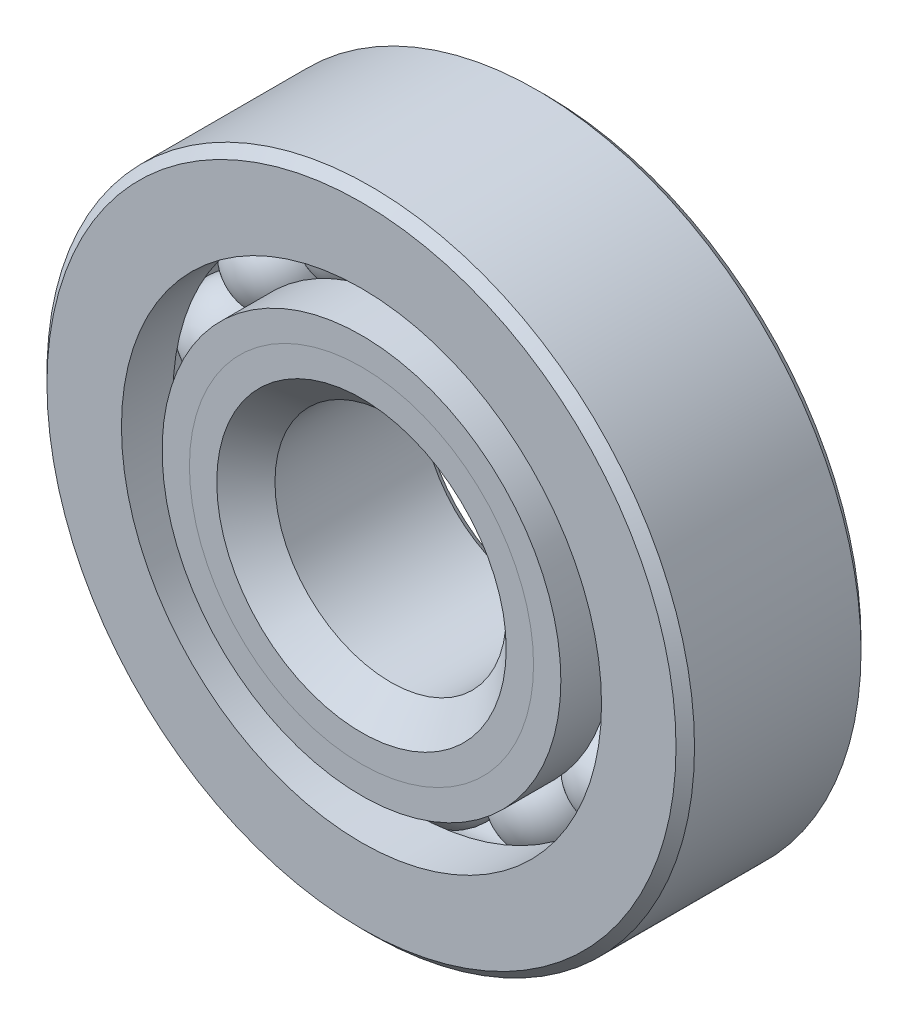
ISO-10303-21;
HEADER;
FILE_DESCRIPTION(('STEP AP214'),'2;1');
FILE_NAME('part.step','',(''),(''),'','','');
FILE_SCHEMA(('AUTOMOTIVE_DESIGN { 1 0 10303 214 1 1 1 1 }'));
ENDSEC;
DATA;
#1=APPLICATION_CONTEXT('core data for automotive mechanical design processes');
#2=APPLICATION_PROTOCOL_DEFINITION('international standard','automotive_design',2000,#1);
#3=PRODUCT_CONTEXT('',#1,'mechanical');
#4=PRODUCT('Part','Part','',(#3));
#5=PRODUCT_RELATED_PRODUCT_CATEGORY('part','',(#4));
#6=PRODUCT_DEFINITION_FORMATION('','',#4);
#7=PRODUCT_DEFINITION_CONTEXT('part definition',#1,'design');
#8=PRODUCT_DEFINITION('design','',#6,#7);
#9=PRODUCT_DEFINITION_SHAPE('','',#8);
#10=(LENGTH_UNIT() NAMED_UNIT(*) SI_UNIT(.MILLI.,.METRE.));
#11=(NAMED_UNIT(*) PLANE_ANGLE_UNIT() SI_UNIT($,.RADIAN.));
#12=(NAMED_UNIT(*) SI_UNIT($,.STERADIAN.) SOLID_ANGLE_UNIT());
#13=UNCERTAINTY_MEASURE_WITH_UNIT(LENGTH_MEASURE(1.E-05),#10,'distance_accuracy_value','');
#14=(GEOMETRIC_REPRESENTATION_CONTEXT(3) GLOBAL_UNCERTAINTY_ASSIGNED_CONTEXT((#13)) GLOBAL_UNIT_ASSIGNED_CONTEXT((#10,
#11,#12)) REPRESENTATION_CONTEXT('',''));
#15=CARTESIAN_POINT('',(0.,0.,0.));
#16=DIRECTION('',(0.,0.,1.));
#17=DIRECTION('',(1.,0.,0.));
#18=AXIS2_PLACEMENT_3D('',#15,#16,#17);
#19=CARTESIAN_POINT('',(-3.27175457028325,6.79386836952672,0.));
#20=DIRECTION('',(0.,0.,1.));
#21=DIRECTION('',(0.433883739117546,-0.900968867902425,0.));
#22=AXIS2_PLACEMENT_3D('',#19,#20,#21);
#23=SPHERICAL_SURFACE('',#22,1.57421805197336);
#24=CARTESIAN_POINT('',(-3.27175457028325,6.79386836952672,1.57421805197336));
#25=VERTEX_POINT('',#24);
#26=VERTEX_LOOP('',#25);
#27=FACE_BOUND('',#26,.T.);
#28=ADVANCED_FACE('F42',(#27),#23,.T.);
#29=CLOSED_SHELL('',(#28));
#30=MANIFOLD_SOLID_BREP('B2',#29);
#31=CARTESIAN_POINT('',(-5.89549802248543,4.70150278714109,0.));
#32=DIRECTION('',(0.,0.,1.));
#33=DIRECTION('',(0.781831482468022,-0.623489801858743,0.));
#34=AXIS2_PLACEMENT_3D('',#31,#32,#33);
#35=SPHERICAL_SURFACE('',#34,1.57421805197336);
#36=CARTESIAN_POINT('',(-5.89549802248543,4.70150278714109,1.57421805197336));
#37=VERTEX_POINT('',#36);
#38=VERTEX_LOOP('',#37);
#39=FACE_BOUND('',#38,.T.);
#40=ADVANCED_FACE('F64',(#39),#35,.T.);
#41=CLOSED_SHELL('',(#40));
#42=MANIFOLD_SOLID_BREP('B7',#41);
#43=CARTESIAN_POINT('',(-7.35156578779605,1.67794691761441,0.));
#44=DIRECTION('',(0.,0.,1.));
#45=DIRECTION('',(0.974927912181821,-0.222520933956325,0.));
#46=AXIS2_PLACEMENT_3D('',#43,#44,#45);
#47=SPHERICAL_SURFACE('',#46,1.57421805197336);
#48=CARTESIAN_POINT('',(-7.35156578779605,1.67794691761441,1.57421805197336));
#49=VERTEX_POINT('',#48);
#50=VERTEX_LOOP('',#49);
#51=FACE_BOUND('',#50,.T.);
#52=ADVANCED_FACE('F86',(#51),#47,.T.);
#53=CLOSED_SHELL('',(#52));
#54=MANIFOLD_SOLID_BREP('B38',#53);
#55=CARTESIAN_POINT('',(-7.35156578779608,-1.67794691761426,0.));
#56=DIRECTION('',(0.,0.,1.));
#57=DIRECTION('',(0.974927912181826,0.222520933956305,0.));
#58=AXIS2_PLACEMENT_3D('',#55,#56,#57);
#59=SPHERICAL_SURFACE('',#58,1.57421805197336);
#60=CARTESIAN_POINT('',(-7.35156578779608,-1.67794691761426,1.57421805197336));
#61=VERTEX_POINT('',#60);
#62=VERTEX_LOOP('',#61);
#63=FACE_BOUND('',#62,.T.);
#64=ADVANCED_FACE('F108',(#63),#59,.T.);
#65=CLOSED_SHELL('',(#64));
#66=MANIFOLD_SOLID_BREP('B60',#65);
#67=CARTESIAN_POINT('',(-5.89549802248553,-4.70150278714096,0.));
#68=DIRECTION('',(0.,0.,1.));
#69=DIRECTION('',(0.781831482468035,0.623489801858727,0.));
#70=AXIS2_PLACEMENT_3D('',#67,#68,#69);
#71=SPHERICAL_SURFACE('',#70,1.57421805197336);
#72=CARTESIAN_POINT('',(-5.89549802248553,-4.70150278714096,1.57421805197336));
#73=VERTEX_POINT('',#72);
#74=VERTEX_LOOP('',#73);
#75=FACE_BOUND('',#74,.T.);
#76=ADVANCED_FACE('F130',(#75),#71,.T.);
#77=CLOSED_SHELL('',(#76));
#78=MANIFOLD_SOLID_BREP('B82',#77);
#79=CARTESIAN_POINT('',(-3.27175457028339,-6.79386836952665,0.));
#80=DIRECTION('',(0.,0.,1.));
#81=DIRECTION('',(0.433883739117565,0.900968867902416,0.));
#82=AXIS2_PLACEMENT_3D('',#79,#80,#81);
#83=SPHERICAL_SURFACE('',#82,1.57421805197336);
#84=CARTESIAN_POINT('',(-3.27175457028339,-6.79386836952665,1.57421805197336));
#85=VERTEX_POINT('',#84);
#86=VERTEX_LOOP('',#85);
#87=FACE_BOUND('',#86,.T.);
#88=ADVANCED_FACE('F151',(#87),#83,.T.);
#89=CLOSED_SHELL('',(#88));
#90=MANIFOLD_SOLID_BREP('B104',#89);
#91=CARTESIAN_POINT('',(0.,-7.540625,0.));
#92=DIRECTION('',(0.,0.,1.));
#93=DIRECTION('',(0.,1.,0.));
#94=AXIS2_PLACEMENT_3D('',#91,#92,#93);
#95=SPHERICAL_SURFACE('',#94,1.57421805197336);
#96=CARTESIAN_POINT('',(0.,-7.540625,1.57421805197336));
#97=VERTEX_POINT('',#96);
#98=VERTEX_LOOP('',#97);
#99=FACE_BOUND('',#98,.T.);
#100=ADVANCED_FACE('F169',(#99),#95,.T.);
#101=CLOSED_SHELL('',(#100));
#102=MANIFOLD_SOLID_BREP('B126',#101);
#103=CARTESIAN_POINT('',(3.2717545702833,-6.7938683695267,0.));
#104=DIRECTION('',(0.,0.,1.));
#105=DIRECTION('',(-0.433883739117553,0.900968867902422,0.));
#106=AXIS2_PLACEMENT_3D('',#103,#104,#105);
#107=SPHERICAL_SURFACE('',#106,1.57421805197336);
#108=CARTESIAN_POINT('',(3.2717545702833,-6.7938683695267,1.57421805197336));
#109=VERTEX_POINT('',#108);
#110=VERTEX_LOOP('',#109);
#111=FACE_BOUND('',#110,.T.);
#112=ADVANCED_FACE('F187',(#111),#107,.T.);
#113=CLOSED_SHELL('',(#112));
#114=MANIFOLD_SOLID_BREP('B147',#113);
#115=CARTESIAN_POINT('',(5.89549802248546,-4.70150278714104,0.));
#116=DIRECTION('',(0.,0.,1.));
#117=DIRECTION('',(-0.781831482468027,0.623489801858737,0.));
#118=AXIS2_PLACEMENT_3D('',#115,#116,#117);
#119=SPHERICAL_SURFACE('',#118,1.57421805197336);
#120=CARTESIAN_POINT('',(5.89549802248546,-4.70150278714104,1.57421805197336));
#121=VERTEX_POINT('',#120);
#122=VERTEX_LOOP('',#121);
#123=FACE_BOUND('',#122,.T.);
#124=ADVANCED_FACE('F205',(#123),#119,.T.);
#125=CLOSED_SHELL('',(#124));
#126=MANIFOLD_SOLID_BREP('B165',#125);
#127=CARTESIAN_POINT('',(7.35156578779606,-1.67794691761436,0.));
#128=DIRECTION('',(0.,0.,1.));
#129=DIRECTION('',(-0.974927912181823,0.222520933956318,0.));
#130=AXIS2_PLACEMENT_3D('',#127,#128,#129);
#131=SPHERICAL_SURFACE('',#130,1.57421805197336);
#132=CARTESIAN_POINT('',(7.35156578779606,-1.67794691761436,1.57421805197336));
#133=VERTEX_POINT('',#132);
#134=VERTEX_LOOP('',#133);
#135=FACE_BOUND('',#134,.T.);
#136=ADVANCED_FACE('F223',(#135),#131,.T.);
#137=CLOSED_SHELL('',(#136));
#138=MANIFOLD_SOLID_BREP('B183',#137);
#139=CARTESIAN_POINT('',(7.35156578779607,1.67794691761431,0.));
#140=DIRECTION('',(0.,0.,1.));
#141=DIRECTION('',(-0.974927912181824,-0.222520933956311,0.));
#142=AXIS2_PLACEMENT_3D('',#139,#140,#141);
#143=SPHERICAL_SURFACE('',#142,1.57421805197336);
#144=CARTESIAN_POINT('',(7.35156578779607,1.67794691761431,1.57421805197336));
#145=VERTEX_POINT('',#144);
#146=VERTEX_LOOP('',#145);
#147=FACE_BOUND('',#146,.T.);
#148=ADVANCED_FACE('F241',(#147),#143,.T.);
#149=CLOSED_SHELL('',(#148));
#150=MANIFOLD_SOLID_BREP('B201',#149);
#151=CARTESIAN_POINT('',(5.8954980224855,4.701502787141,0.));
#152=DIRECTION('',(0.,0.,1.));
#153=DIRECTION('',(-0.781831482468031,-0.623489801858732,0.));
#154=AXIS2_PLACEMENT_3D('',#151,#152,#153);
#155=SPHERICAL_SURFACE('',#154,1.57421805197336);
#156=CARTESIAN_POINT('',(5.8954980224855,4.701502787141,1.57421805197336));
#157=VERTEX_POINT('',#156);
#158=VERTEX_LOOP('',#157);
#159=FACE_BOUND('',#158,.T.);
#160=ADVANCED_FACE('F259',(#159),#155,.T.);
#161=CLOSED_SHELL('',(#160));
#162=MANIFOLD_SOLID_BREP('B219',#161);
#163=CARTESIAN_POINT('',(3.27175457028334,6.79386836952668,0.));
#164=DIRECTION('',(0.,0.,1.));
#165=DIRECTION('',(-0.433883739117559,-0.900968867902419,0.));
#166=AXIS2_PLACEMENT_3D('',#163,#164,#165);
#167=SPHERICAL_SURFACE('',#166,1.57421805197336);
#168=CARTESIAN_POINT('',(3.27175457028334,6.79386836952668,1.57421805197336));
#169=VERTEX_POINT('',#168);
#170=VERTEX_LOOP('',#169);
#171=FACE_BOUND('',#170,.T.);
#172=ADVANCED_FACE('F277',(#171),#167,.T.);
#173=CLOSED_SHELL('',(#172));
#174=MANIFOLD_SOLID_BREP('B237',#173);
#175=CARTESIAN_POINT('',(0.,7.540625,0.));
#176=DIRECTION('',(0.,0.,1.));
#177=DIRECTION('',(0.,-1.,0.));
#178=AXIS2_PLACEMENT_3D('',#175,#176,#177);
#179=SPHERICAL_SURFACE('',#178,1.57421805197336);
#180=CARTESIAN_POINT('',(0.,7.540625,1.57421805197336));
#181=VERTEX_POINT('',#180);
#182=VERTEX_LOOP('',#181);
#183=FACE_BOUND('',#182,.T.);
#184=ADVANCED_FACE('F299',(#183),#179,.T.);
#185=CLOSED_SHELL('',(#184));
#186=MANIFOLD_SOLID_BREP('B255',#185);
#187=CARTESIAN_POINT('',(0.,5.90520063810556,3.175));
#188=DIRECTION('',(0.,0.,-1.));
#189=DIRECTION('',(-1.,0.,0.));
#190=AXIS2_PLACEMENT_3D('',#187,#188,#189);
#191=PLANE('',#190);
#192=CARTESIAN_POINT('',(0.,0.,3.175));
#193=DIRECTION('',(0.,0.,1.));
#194=DIRECTION('',(1.,0.,0.));
#195=AXIS2_PLACEMENT_3D('',#192,#193,#194);
#196=CIRCLE('',#195,4.96757847401332);
#197=CARTESIAN_POINT('',(4.96757847401332,0.,3.175));
#198=VERTEX_POINT('',#197);
#199=EDGE_CURVE('E361',#198,#198,#196,.T.);
#200=ORIENTED_EDGE('',*,*,#199,.F.);
#201=EDGE_LOOP('',(#200));
#202=FACE_BOUND('',#201,.T.);
#203=CARTESIAN_POINT('',(0.,0.,3.175));
#204=DIRECTION('',(0.,0.,1.));
#205=DIRECTION('',(1.,0.,0.));
#206=AXIS2_PLACEMENT_3D('',#203,#204,#205);
#207=CIRCLE('',#206,5.90520063810556);
#208=CARTESIAN_POINT('',(5.90520063810556,0.,3.175));
#209=VERTEX_POINT('',#208);
#210=EDGE_CURVE('E298',#209,#209,#207,.T.);
#211=ORIENTED_EDGE('',*,*,#210,.T.);
#212=EDGE_LOOP('',(#211));
#213=FACE_BOUND('',#212,.T.);
#214=ADVANCED_FACE('F327',(#202,#213),#191,.F.);
#215=CARTESIAN_POINT('',(0.,0.,2.23737783590776));
#216=DIRECTION('',(0.,0.,1.));
#217=DIRECTION('',(1.,0.,0.));
#218=AXIS2_PLACEMENT_3D('',#215,#216,#217);
#219=CONICAL_SURFACE('',#218,4.96757847401332,0.785398163397451);
#220=ORIENTED_EDGE('',*,*,#210,.F.);
#221=EDGE_LOOP('',(#220));
#222=FACE_BOUND('',#221,.T.);
#223=CARTESIAN_POINT('',(0.,0.,2.23737783590776));
#224=DIRECTION('',(0.,0.,1.));
#225=DIRECTION('',(1.,0.,0.));
#226=AXIS2_PLACEMENT_3D('',#223,#224,#225);
#227=CIRCLE('',#226,4.96757847401332);
#228=CARTESIAN_POINT('',(4.96757847401332,0.,2.23737783590776));
#229=VERTEX_POINT('',#228);
#230=EDGE_CURVE('E333',#229,#229,#227,.T.);
#231=ORIENTED_EDGE('',*,*,#230,.T.);
#232=EDGE_LOOP('',(#231));
#233=FACE_BOUND('',#232,.T.);
#234=ADVANCED_FACE('F368',(#222,#233),#219,.T.);
#235=CARTESIAN_POINT('',(0.,0.,3.175));
#236=DIRECTION('',(0.,0.,1.));
#237=DIRECTION('',(1.,0.,0.));
#238=AXIS2_PLACEMENT_3D('',#235,#236,#237);
#239=CYLINDRICAL_SURFACE('',#238,4.96757847401332);
#240=ORIENTED_EDGE('',*,*,#230,.F.);
#241=EDGE_LOOP('',(#240));
#242=FACE_BOUND('',#241,.T.);
#243=CARTESIAN_POINT('',(0.,0.,0.));
#244=DIRECTION('',(0.,0.,1.));
#245=DIRECTION('',(1.,0.,0.));
#246=AXIS2_PLACEMENT_3D('',#243,#244,#245);
#247=CIRCLE('',#246,4.96757847401332);
#248=CARTESIAN_POINT('',(4.96757847401332,0.,0.));
#249=VERTEX_POINT('',#248);
#250=EDGE_CURVE('E337',#249,#249,#247,.T.);
#251=ORIENTED_EDGE('',*,*,#250,.T.);
#252=EDGE_LOOP('',(#251));
#253=FACE_BOUND('',#252,.T.);
#254=ADVANCED_FACE('F372',(#242,#253),#239,.T.);
#255=CARTESIAN_POINT('',(0.,4.96757847401332,0.));
#256=DIRECTION('',(0.,0.,-1.));
#257=DIRECTION('',(-1.,0.,0.));
#258=AXIS2_PLACEMENT_3D('',#255,#256,#257);
#259=PLANE('',#258);
#260=ORIENTED_EDGE('',*,*,#250,.F.);
#261=EDGE_LOOP('',(#260));
#262=FACE_BOUND('',#261,.T.);
#263=CARTESIAN_POINT('',(0.,0.,0.));
#264=DIRECTION('',(0.,0.,1.));
#265=DIRECTION('',(1.,0.,0.));
#266=AXIS2_PLACEMENT_3D('',#263,#264,#265);
#267=CIRCLE('',#266,5.96640694802664);
#268=CARTESIAN_POINT('',(5.96640694802664,0.,0.));
#269=VERTEX_POINT('',#268);
#270=EDGE_CURVE('E341',#269,#269,#267,.T.);
#271=ORIENTED_EDGE('',*,*,#270,.T.);
#272=EDGE_LOOP('',(#271));
#273=FACE_BOUND('',#272,.T.);
#274=ADVANCED_FACE('F377',(#262,#273),#259,.F.);
#275=CARTESIAN_POINT('',(0.,0.,0.));
#276=DIRECTION('',(0.,0.,1.));
#277=DIRECTION('',(1.,0.,0.));
#278=AXIS2_PLACEMENT_3D('',#275,#276,#277);
#279=TOROIDAL_SURFACE('',#278,7.540625,1.57421805197336);
#280=ORIENTED_EDGE('',*,*,#270,.F.);
#281=EDGE_LOOP('',(#280));
#282=FACE_BOUND('',#281,.T.);
#283=CARTESIAN_POINT('',(0.,0.,-1.41111111111111));
#284=DIRECTION('',(0.,0.,1.));
#285=DIRECTION('',(1.,0.,0.));
#286=AXIS2_PLACEMENT_3D('',#283,#284,#285);
#287=CIRCLE('',#286,6.8428228021978);
#288=CARTESIAN_POINT('',(6.8428228021978,0.,-1.41111111111111));
#289=VERTEX_POINT('',#288);
#290=EDGE_CURVE('E346',#289,#289,#287,.T.);
#291=ORIENTED_EDGE('',*,*,#290,.T.);
#292=EDGE_LOOP('',(#291));
#293=FACE_BOUND('',#292,.T.);
#294=ADVANCED_FACE('F383',(#282,#293),#279,.F.);
#295=CARTESIAN_POINT('',(0.,0.,3.175));
#296=DIRECTION('',(0.,0.,1.));
#297=DIRECTION('',(1.,0.,0.));
#298=AXIS2_PLACEMENT_3D('',#295,#296,#297);
#299=CYLINDRICAL_SURFACE('',#298,6.8428228021978);
#300=ORIENTED_EDGE('',*,*,#290,.F.);
#301=EDGE_LOOP('',(#300));
#302=FACE_BOUND('',#301,.T.);
#303=CARTESIAN_POINT('',(0.,0.,-3.175));
#304=DIRECTION('',(0.,0.,1.));
#305=DIRECTION('',(1.,0.,0.));
#306=AXIS2_PLACEMENT_3D('',#303,#304,#305);
#307=CIRCLE('',#306,6.8428228021978);
#308=CARTESIAN_POINT('',(6.8428228021978,0.,-3.175));
#309=VERTEX_POINT('',#308);
#310=EDGE_CURVE('E349',#309,#309,#307,.T.);
#311=ORIENTED_EDGE('',*,*,#310,.T.);
#312=EDGE_LOOP('',(#311));
#313=FACE_BOUND('',#312,.T.);
#314=ADVANCED_FACE('F387',(#302,#313),#299,.T.);
#315=CARTESIAN_POINT('',(0.,4.28625,-3.175));
#316=DIRECTION('',(0.,0.,1.));
#317=DIRECTION('',(1.,0.,0.));
#318=AXIS2_PLACEMENT_3D('',#315,#316,#317);
#319=PLANE('',#318);
#320=ORIENTED_EDGE('',*,*,#310,.F.);
#321=EDGE_LOOP('',(#320));
#322=FACE_BOUND('',#321,.T.);
#323=CARTESIAN_POINT('',(0.,0.,-3.175));
#324=DIRECTION('',(0.,0.,1.));
#325=DIRECTION('',(1.,0.,0.));
#326=AXIS2_PLACEMENT_3D('',#323,#324,#325);
#327=CIRCLE('',#326,4.28625);
#328=CARTESIAN_POINT('',(4.28625,0.,-3.175));
#329=VERTEX_POINT('',#328);
#330=EDGE_CURVE('E352',#329,#329,#327,.T.);
#331=ORIENTED_EDGE('',*,*,#330,.T.);
#332=EDGE_LOOP('',(#331));
#333=FACE_BOUND('',#332,.T.);
#334=ADVANCED_FACE('F391',(#322,#333),#319,.F.);
#335=CARTESIAN_POINT('',(0.,0.,-2.8575));
#336=DIRECTION('',(0.,0.,-1.));
#337=DIRECTION('',(-1.,0.,0.));
#338=AXIS2_PLACEMENT_3D('',#335,#336,#337);
#339=CONICAL_SURFACE('',#338,3.96875,0.78539816339745);
#340=ORIENTED_EDGE('',*,*,#330,.F.);
#341=EDGE_LOOP('',(#340));
#342=FACE_BOUND('',#341,.T.);
#343=CARTESIAN_POINT('',(0.,0.,-2.8575));
#344=DIRECTION('',(0.,0.,1.));
#345=DIRECTION('',(1.,0.,0.));
#346=AXIS2_PLACEMENT_3D('',#343,#344,#345);
#347=CIRCLE('',#346,3.96875);
#348=CARTESIAN_POINT('',(3.96875,0.,-2.8575));
#349=VERTEX_POINT('',#348);
#350=EDGE_CURVE('E355',#349,#349,#347,.T.);
#351=ORIENTED_EDGE('',*,*,#350,.T.);
#352=EDGE_LOOP('',(#351));
#353=FACE_BOUND('',#352,.T.);
#354=ADVANCED_FACE('F395',(#342,#353),#339,.F.);
#355=CARTESIAN_POINT('',(0.,0.,3.175));
#356=DIRECTION('',(0.,0.,1.));
#357=DIRECTION('',(1.,0.,0.));
#358=AXIS2_PLACEMENT_3D('',#355,#356,#357);
#359=CYLINDRICAL_SURFACE('',#358,3.96875);
#360=ORIENTED_EDGE('',*,*,#350,.F.);
#361=EDGE_LOOP('',(#360));
#362=FACE_BOUND('',#361,.T.);
#363=CARTESIAN_POINT('',(0.,0.,2.17617152598669));
#364=DIRECTION('',(0.,0.,1.));
#365=DIRECTION('',(1.,0.,0.));
#366=AXIS2_PLACEMENT_3D('',#363,#364,#365);
#367=CIRCLE('',#366,3.96875);
#368=CARTESIAN_POINT('',(3.96875,0.,2.17617152598669));
#369=VERTEX_POINT('',#368);
#370=EDGE_CURVE('E358',#369,#369,#367,.T.);
#371=ORIENTED_EDGE('',*,*,#370,.T.);
#372=EDGE_LOOP('',(#371));
#373=FACE_BOUND('',#372,.T.);
#374=ADVANCED_FACE('F399',(#362,#373),#359,.F.);
#375=CARTESIAN_POINT('',(0.,0.,3.175));
#376=DIRECTION('',(0.,0.,1.));
#377=DIRECTION('',(1.,0.,0.));
#378=AXIS2_PLACEMENT_3D('',#375,#376,#377);
#379=CONICAL_SURFACE('',#378,4.96757847401332,0.78539816339745);
#380=ORIENTED_EDGE('',*,*,#370,.F.);
#381=EDGE_LOOP('',(#380));
#382=FACE_BOUND('',#381,.T.);
#383=ORIENTED_EDGE('',*,*,#199,.T.);
#384=EDGE_LOOP('',(#383));
#385=FACE_BOUND('',#384,.T.);
#386=ADVANCED_FACE('F365',(#382,#385),#379,.F.);
#387=CLOSED_SHELL('',(#214,#234,#254,#274,#294,#314,#334,#354,#374,#386));
#388=MANIFOLD_SOLID_BREP('B273',#387);
#389=CARTESIAN_POINT('',(0.,6.8428228021978,3.175));
#390=DIRECTION('',(0.,0.,-1.));
#391=DIRECTION('',(-1.,0.,0.));
#392=AXIS2_PLACEMENT_3D('',#389,#390,#391);
#393=PLANE('',#392);
#394=CARTESIAN_POINT('',(0.,0.,3.175));
#395=DIRECTION('',(0.,0.,1.));
#396=DIRECTION('',(1.,0.,0.));
#397=AXIS2_PLACEMENT_3D('',#394,#395,#396);
#398=CIRCLE('',#397,5.90520063810556);
#399=CARTESIAN_POINT('',(5.90520063810556,0.,3.175));
#400=VERTEX_POINT('',#399);
#401=EDGE_CURVE('E326',#400,#400,#398,.T.);
#402=ORIENTED_EDGE('',*,*,#401,.F.);
#403=EDGE_LOOP('',(#402));
#404=FACE_BOUND('',#403,.T.);
#405=CARTESIAN_POINT('',(0.,0.,3.175));
#406=DIRECTION('',(0.,0.,1.));
#407=DIRECTION('',(1.,0.,0.));
#408=AXIS2_PLACEMENT_3D('',#405,#406,#407);
#409=CIRCLE('',#408,6.8428228021978);
#410=CARTESIAN_POINT('',(6.8428228021978,0.,3.175));
#411=VERTEX_POINT('',#410);
#412=EDGE_CURVE('E515',#411,#411,#409,.T.);
#413=ORIENTED_EDGE('',*,*,#412,.T.);
#414=EDGE_LOOP('',(#413));
#415=FACE_BOUND('',#414,.T.);
#416=ADVANCED_FACE('F493',(#404,#415),#393,.F.);
#417=CARTESIAN_POINT('',(0.,0.,3.175));
#418=DIRECTION('',(0.,0.,1.));
#419=DIRECTION('',(1.,0.,0.));
#420=AXIS2_PLACEMENT_3D('',#417,#418,#419);
#421=CONICAL_SURFACE('',#420,5.90520063810556,0.785398163397451);
#422=CARTESIAN_POINT('',(0.,0.,2.23737783590776));
#423=DIRECTION('',(0.,0.,1.));
#424=DIRECTION('',(1.,0.,0.));
#425=AXIS2_PLACEMENT_3D('',#422,#423,#424);
#426=CIRCLE('',#425,4.96757847401332);
#427=CARTESIAN_POINT('',(4.96757847401332,0.,2.23737783590776));
#428=VERTEX_POINT('',#427);
#429=EDGE_CURVE('E499',#428,#428,#426,.T.);
#430=ORIENTED_EDGE('',*,*,#429,.F.);
#431=EDGE_LOOP('',(#430));
#432=FACE_BOUND('',#431,.T.);
#433=ORIENTED_EDGE('',*,*,#401,.T.);
#434=EDGE_LOOP('',(#433));
#435=FACE_BOUND('',#434,.T.);
#436=ADVANCED_FACE('F540',(#432,#435),#421,.F.);
#437=CARTESIAN_POINT('',(0.,0.,3.175));
#438=DIRECTION('',(0.,0.,1.));
#439=DIRECTION('',(1.,0.,0.));
#440=AXIS2_PLACEMENT_3D('',#437,#438,#439);
#441=CYLINDRICAL_SURFACE('',#440,4.96757847401332);
#442=CARTESIAN_POINT('',(0.,0.,0.));
#443=DIRECTION('',(0.,0.,1.));
#444=DIRECTION('',(1.,0.,0.));
#445=AXIS2_PLACEMENT_3D('',#442,#443,#444);
#446=CIRCLE('',#445,4.96757847401332);
#447=CARTESIAN_POINT('',(4.96757847401332,0.,0.));
#448=VERTEX_POINT('',#447);
#449=EDGE_CURVE('E503',#448,#448,#446,.T.);
#450=ORIENTED_EDGE('',*,*,#449,.F.);
#451=EDGE_LOOP('',(#450));
#452=FACE_BOUND('',#451,.T.);
#453=ORIENTED_EDGE('',*,*,#429,.T.);
#454=EDGE_LOOP('',(#453));
#455=FACE_BOUND('',#454,.T.);
#456=ADVANCED_FACE('F535',(#452,#455),#441,.F.);
#457=CARTESIAN_POINT('',(0.,4.96757847401332,0.));
#458=DIRECTION('',(0.,0.,1.));
#459=DIRECTION('',(1.,0.,0.));
#460=AXIS2_PLACEMENT_3D('',#457,#458,#459);
#461=PLANE('',#460);
#462=CARTESIAN_POINT('',(0.,0.,0.));
#463=DIRECTION('',(0.,0.,1.));
#464=DIRECTION('',(1.,0.,0.));
#465=AXIS2_PLACEMENT_3D('',#462,#463,#464);
#466=CIRCLE('',#465,5.96640694802664);
#467=CARTESIAN_POINT('',(5.96640694802664,0.,0.));
#468=VERTEX_POINT('',#467);
#469=EDGE_CURVE('E507',#468,#468,#466,.T.);
#470=ORIENTED_EDGE('',*,*,#469,.F.);
#471=EDGE_LOOP('',(#470));
#472=FACE_BOUND('',#471,.T.);
#473=ORIENTED_EDGE('',*,*,#449,.T.);
#474=EDGE_LOOP('',(#473));
#475=FACE_BOUND('',#474,.T.);
#476=ADVANCED_FACE('F529',(#472,#475),#461,.F.);
#477=CARTESIAN_POINT('',(0.,0.,0.));
#478=DIRECTION('',(0.,0.,1.));
#479=DIRECTION('',(1.,0.,0.));
#480=AXIS2_PLACEMENT_3D('',#477,#478,#479);
#481=TOROIDAL_SURFACE('',#480,7.540625,1.57421805197336);
#482=CARTESIAN_POINT('',(0.,0.,1.41111111111111));
#483=DIRECTION('',(0.,0.,1.));
#484=DIRECTION('',(1.,0.,0.));
#485=AXIS2_PLACEMENT_3D('',#482,#483,#484);
#486=CIRCLE('',#485,6.8428228021978);
#487=CARTESIAN_POINT('',(6.8428228021978,0.,1.41111111111111));
#488=VERTEX_POINT('',#487);
#489=EDGE_CURVE('E512',#488,#488,#486,.T.);
#490=ORIENTED_EDGE('',*,*,#489,.F.);
#491=EDGE_LOOP('',(#490));
#492=FACE_BOUND('',#491,.T.);
#493=ORIENTED_EDGE('',*,*,#469,.T.);
#494=EDGE_LOOP('',(#493));
#495=FACE_BOUND('',#494,.T.);
#496=ADVANCED_FACE('F523',(#492,#495),#481,.F.);
#497=CARTESIAN_POINT('',(0.,0.,3.175));
#498=DIRECTION('',(0.,0.,1.));
#499=DIRECTION('',(1.,0.,0.));
#500=AXIS2_PLACEMENT_3D('',#497,#498,#499);
#501=CYLINDRICAL_SURFACE('',#500,6.8428228021978);
#502=ORIENTED_EDGE('',*,*,#412,.F.);
#503=EDGE_LOOP('',(#502));
#504=FACE_BOUND('',#503,.T.);
#505=ORIENTED_EDGE('',*,*,#489,.T.);
#506=EDGE_LOOP('',(#505));
#507=FACE_BOUND('',#506,.T.);
#508=ADVANCED_FACE('F520',(#504,#507),#501,.T.);
#509=CLOSED_SHELL('',(#416,#436,#456,#476,#496,#508));
#510=MANIFOLD_SOLID_BREP('B293',#509);
#511=CARTESIAN_POINT('',(0.,0.,2.8575));
#512=DIRECTION('',(0.,0.,-1.));
#513=DIRECTION('',(-1.,0.,0.));
#514=AXIS2_PLACEMENT_3D('',#511,#512,#513);
#515=CONICAL_SURFACE('',#514,11.1125,0.785398163397448);
#516=CARTESIAN_POINT('',(0.,0.,3.175));
#517=DIRECTION('',(0.,0.,1.));
#518=DIRECTION('',(1.,0.,0.));
#519=AXIS2_PLACEMENT_3D('',#516,#517,#518);
#520=CIRCLE('',#519,10.795);
#521=CARTESIAN_POINT('',(10.795,0.,3.175));
#522=VERTEX_POINT('',#521);
#523=EDGE_CURVE('E618',#522,#522,#520,.T.);
#524=ORIENTED_EDGE('',*,*,#523,.F.);
#525=EDGE_LOOP('',(#524));
#526=FACE_BOUND('',#525,.T.);
#527=CARTESIAN_POINT('',(0.,0.,2.8575));
#528=DIRECTION('',(0.,0.,1.));
#529=DIRECTION('',(1.,0.,0.));
#530=AXIS2_PLACEMENT_3D('',#527,#528,#529);
#531=CIRCLE('',#530,11.1125);
#532=CARTESIAN_POINT('',(11.1125,0.,2.8575));
#533=VERTEX_POINT('',#532);
#534=EDGE_CURVE('E492',#533,#533,#531,.T.);
#535=ORIENTED_EDGE('',*,*,#534,.T.);
#536=EDGE_LOOP('',(#535));
#537=FACE_BOUND('',#536,.T.);
#538=ADVANCED_FACE('F590',(#526,#537),#515,.T.);
#539=CARTESIAN_POINT('',(0.,0.,3.175));
#540=DIRECTION('',(0.,0.,1.));
#541=DIRECTION('',(1.,0.,0.));
#542=AXIS2_PLACEMENT_3D('',#539,#540,#541);
#543=CYLINDRICAL_SURFACE('',#542,11.1125);
#544=ORIENTED_EDGE('',*,*,#534,.F.);
#545=EDGE_LOOP('',(#544));
#546=FACE_BOUND('',#545,.T.);
#547=CARTESIAN_POINT('',(0.,0.,-2.8575));
#548=DIRECTION('',(0.,0.,1.));
#549=DIRECTION('',(1.,0.,0.));
#550=AXIS2_PLACEMENT_3D('',#547,#548,#549);
#551=CIRCLE('',#550,11.1125);
#552=CARTESIAN_POINT('',(11.1125,0.,-2.8575));
#553=VERTEX_POINT('',#552);
#554=EDGE_CURVE('E596',#553,#553,#551,.T.);
#555=ORIENTED_EDGE('',*,*,#554,.T.);
#556=EDGE_LOOP('',(#555));
#557=FACE_BOUND('',#556,.T.);
#558=ADVANCED_FACE('F625',(#546,#557),#543,.T.);
#559=CARTESIAN_POINT('',(0.,0.,-3.175));
#560=DIRECTION('',(0.,0.,1.));
#561=DIRECTION('',(1.,0.,0.));
#562=AXIS2_PLACEMENT_3D('',#559,#560,#561);
#563=CONICAL_SURFACE('',#562,10.795,0.785398163397448);
#564=ORIENTED_EDGE('',*,*,#554,.F.);
#565=EDGE_LOOP('',(#564));
#566=FACE_BOUND('',#565,.T.);
#567=CARTESIAN_POINT('',(0.,0.,-3.175));
#568=DIRECTION('',(0.,0.,1.));
#569=DIRECTION('',(1.,0.,0.));
#570=AXIS2_PLACEMENT_3D('',#567,#568,#569);
#571=CIRCLE('',#570,10.795);
#572=CARTESIAN_POINT('',(10.795,0.,-3.175));
#573=VERTEX_POINT('',#572);
#574=EDGE_CURVE('E600',#573,#573,#571,.T.);
#575=ORIENTED_EDGE('',*,*,#574,.T.);
#576=EDGE_LOOP('',(#575));
#577=FACE_BOUND('',#576,.T.);
#578=ADVANCED_FACE('F629',(#566,#577),#563,.T.);
#579=CARTESIAN_POINT('',(0.,10.795,-3.175));
#580=DIRECTION('',(0.,0.,1.));
#581=DIRECTION('',(1.,0.,0.));
#582=AXIS2_PLACEMENT_3D('',#579,#580,#581);
#583=PLANE('',#582);
#584=ORIENTED_EDGE('',*,*,#574,.F.);
#585=EDGE_LOOP('',(#584));
#586=FACE_BOUND('',#585,.T.);
#587=CARTESIAN_POINT('',(0.,0.,-3.17500000000001));
#588=DIRECTION('',(0.,0.,1.));
#589=DIRECTION('',(1.,0.,0.));
#590=AXIS2_PLACEMENT_3D('',#587,#588,#589);
#591=CIRCLE('',#590,8.23842719780219);
#592=CARTESIAN_POINT('',(8.23842719780219,0.,-3.17500000000001));
#593=VERTEX_POINT('',#592);
#594=EDGE_CURVE('E604',#593,#593,#591,.T.);
#595=ORIENTED_EDGE('',*,*,#594,.T.);
#596=EDGE_LOOP('',(#595));
#597=FACE_BOUND('',#596,.T.);
#598=ADVANCED_FACE('F634',(#586,#597),#583,.F.);
#599=CARTESIAN_POINT('',(0.,0.,3.175));
#600=DIRECTION('',(0.,0.,1.));
#601=DIRECTION('',(1.,0.,0.));
#602=AXIS2_PLACEMENT_3D('',#599,#600,#601);
#603=CYLINDRICAL_SURFACE('',#602,8.2384271978022);
#604=ORIENTED_EDGE('',*,*,#594,.F.);
#605=EDGE_LOOP('',(#604));
#606=FACE_BOUND('',#605,.T.);
#607=CARTESIAN_POINT('',(0.,0.,-1.41111111111111));
#608=DIRECTION('',(0.,0.,1.));
#609=DIRECTION('',(1.,0.,0.));
#610=AXIS2_PLACEMENT_3D('',#607,#608,#609);
#611=CIRCLE('',#610,8.2384271978022);
#612=CARTESIAN_POINT('',(8.2384271978022,0.,-1.41111111111111));
#613=VERTEX_POINT('',#612);
#614=EDGE_CURVE('E609',#613,#613,#611,.T.);
#615=ORIENTED_EDGE('',*,*,#614,.T.);
#616=EDGE_LOOP('',(#615));
#617=FACE_BOUND('',#616,.T.);
#618=ADVANCED_FACE('F640',(#606,#617),#603,.F.);
#619=CARTESIAN_POINT('',(0.,0.,0.));
#620=DIRECTION('',(0.,0.,1.));
#621=DIRECTION('',(1.,0.,0.));
#622=AXIS2_PLACEMENT_3D('',#619,#620,#621);
#623=TOROIDAL_SURFACE('',#622,7.540625,1.57421805197336);
#624=ORIENTED_EDGE('',*,*,#614,.F.);
#625=EDGE_LOOP('',(#624));
#626=FACE_BOUND('',#625,.T.);
#627=CARTESIAN_POINT('',(0.,0.,1.41111111111111));
#628=DIRECTION('',(0.,0.,1.));
#629=DIRECTION('',(1.,0.,0.));
#630=AXIS2_PLACEMENT_3D('',#627,#628,#629);
#631=CIRCLE('',#630,8.2384271978022);
#632=CARTESIAN_POINT('',(8.2384271978022,0.,1.41111111111111));
#633=VERTEX_POINT('',#632);
#634=EDGE_CURVE('E612',#633,#633,#631,.T.);
#635=ORIENTED_EDGE('',*,*,#634,.T.);
#636=EDGE_LOOP('',(#635));
#637=FACE_BOUND('',#636,.T.);
#638=ADVANCED_FACE('F644',(#626,#637),#623,.F.);
#639=CARTESIAN_POINT('',(0.,0.,3.175));
#640=DIRECTION('',(0.,0.,1.));
#641=DIRECTION('',(1.,0.,0.));
#642=AXIS2_PLACEMENT_3D('',#639,#640,#641);
#643=CYLINDRICAL_SURFACE('',#642,8.2384271978022);
#644=ORIENTED_EDGE('',*,*,#634,.F.);
#645=EDGE_LOOP('',(#644));
#646=FACE_BOUND('',#645,.T.);
#647=CARTESIAN_POINT('',(0.,0.,3.175));
#648=DIRECTION('',(0.,0.,1.));
#649=DIRECTION('',(1.,0.,0.));
#650=AXIS2_PLACEMENT_3D('',#647,#648,#649);
#651=CIRCLE('',#650,8.23842719780219);
#652=CARTESIAN_POINT('',(8.23842719780219,0.,3.175));
#653=VERTEX_POINT('',#652);
#654=EDGE_CURVE('E615',#653,#653,#651,.T.);
#655=ORIENTED_EDGE('',*,*,#654,.T.);
#656=EDGE_LOOP('',(#655));
#657=FACE_BOUND('',#656,.T.);
#658=ADVANCED_FACE('F648',(#646,#657),#643,.F.);
#659=CARTESIAN_POINT('',(0.,10.795,3.175));
#660=DIRECTION('',(0.,0.,-1.));
#661=DIRECTION('',(-1.,0.,0.));
#662=AXIS2_PLACEMENT_3D('',#659,#660,#661);
#663=PLANE('',#662);
#664=ORIENTED_EDGE('',*,*,#654,.F.);
#665=EDGE_LOOP('',(#664));
#666=FACE_BOUND('',#665,.T.);
#667=ORIENTED_EDGE('',*,*,#523,.T.);
#668=EDGE_LOOP('',(#667));
#669=FACE_BOUND('',#668,.T.);
#670=ADVANCED_FACE('F622',(#666,#669),#663,.F.);
#671=CLOSED_SHELL('',(#538,#558,#578,#598,#618,#638,#658,#670));
#672=MANIFOLD_SOLID_BREP('B321',#671);
#673=ADVANCED_BREP_SHAPE_REPRESENTATION('',(#18,#30,#42,#54,#66,#78,#90,#102,#114,#126,#138,
#150,#162,#174,#186,#388,#510,#672),#14);
#674=SHAPE_DEFINITION_REPRESENTATION(#9,#673);
ENDSEC;
END-ISO-10303-21;
